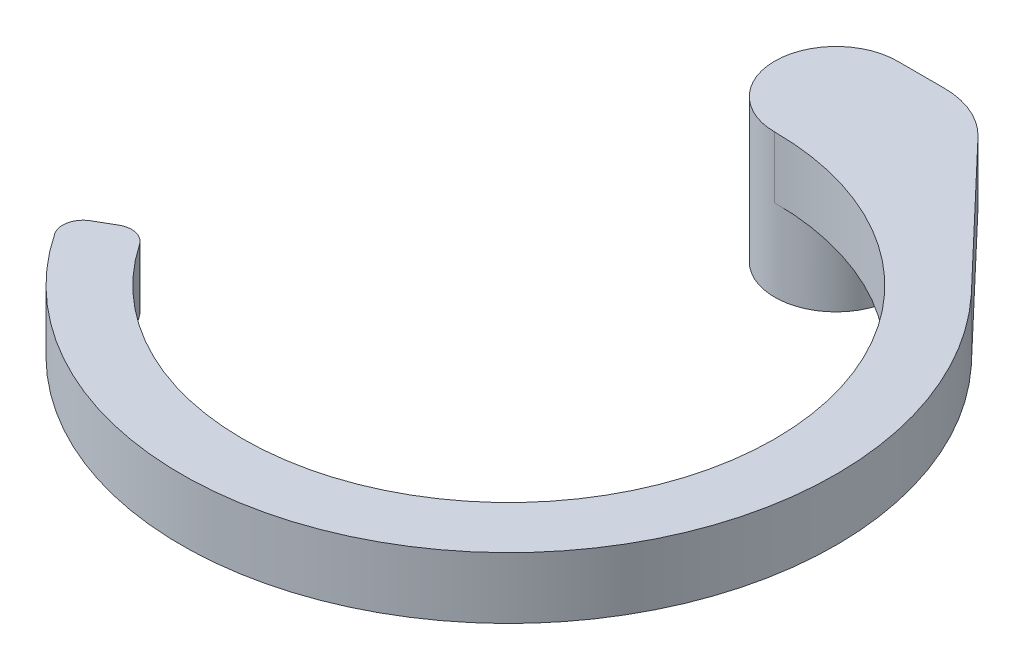
ISO-10303-21;
HEADER;
FILE_DESCRIPTION(('STEP AP214'),'2;1');
FILE_NAME('part.step','',(''),(''),'','','');
FILE_SCHEMA(('AUTOMOTIVE_DESIGN { 1 0 10303 214 1 1 1 1 }'));
ENDSEC;
DATA;
#1=APPLICATION_CONTEXT('core data for automotive mechanical design processes');
#2=APPLICATION_PROTOCOL_DEFINITION('international standard','automotive_design',2000,#1);
#3=PRODUCT_CONTEXT('',#1,'mechanical');
#4=PRODUCT('Part','Part','',(#3));
#5=PRODUCT_RELATED_PRODUCT_CATEGORY('part','',(#4));
#6=PRODUCT_DEFINITION_FORMATION('','',#4);
#7=PRODUCT_DEFINITION_CONTEXT('part definition',#1,'design');
#8=PRODUCT_DEFINITION('design','',#6,#7);
#9=PRODUCT_DEFINITION_SHAPE('','',#8);
#10=(LENGTH_UNIT() NAMED_UNIT(*) SI_UNIT(.MILLI.,.METRE.));
#11=(NAMED_UNIT(*) PLANE_ANGLE_UNIT() SI_UNIT($,.RADIAN.));
#12=(NAMED_UNIT(*) SI_UNIT($,.STERADIAN.) SOLID_ANGLE_UNIT());
#13=UNCERTAINTY_MEASURE_WITH_UNIT(LENGTH_MEASURE(1.E-05),#10,'distance_accuracy_value','');
#14=(GEOMETRIC_REPRESENTATION_CONTEXT(3) GLOBAL_UNCERTAINTY_ASSIGNED_CONTEXT((#13)) GLOBAL_UNIT_ASSIGNED_CONTEXT((#10,
#11,#12)) REPRESENTATION_CONTEXT('',''));
#15=CARTESIAN_POINT('',(0.,0.,0.));
#16=DIRECTION('',(0.,0.,1.));
#17=DIRECTION('',(1.,0.,0.));
#18=AXIS2_PLACEMENT_3D('',#15,#16,#17);
#19=CARTESIAN_POINT('',(0.,0.,0.));
#20=DIRECTION('',(0.,1.,0.));
#21=DIRECTION('',(0.,0.,1.));
#22=AXIS2_PLACEMENT_3D('',#19,#20,#21);
#23=PLANE('',#22);
#24=CARTESIAN_POINT('',(0.,0.,-80.));
#25=DIRECTION('',(0.,-1.,0.));
#26=DIRECTION('',(0.,0.,-1.));
#27=AXIS2_PLACEMENT_3D('',#24,#25,#26);
#28=CIRCLE('',#27,15.);
#29=CARTESIAN_POINT('',(0.,0.,-95.));
#30=VERTEX_POINT('',#29);
#31=CARTESIAN_POINT('',(0.,0.,-65.));
#32=VERTEX_POINT('',#31);
#33=EDGE_CURVE('E169',#30,#32,#28,.T.);
#34=ORIENTED_EDGE('',*,*,#33,.F.);
#35=DIRECTION('',(1.,0.,0.));
#36=VECTOR('',#35,1.);
#37=CARTESIAN_POINT('',(-1.15370923512719E-13,0.,-95.));
#38=LINE('',#37,#36);
#39=CARTESIAN_POINT('',(11.4274013035618,0.,-95.));
#40=VERTEX_POINT('',#39);
#41=EDGE_CURVE('E152',#30,#40,#38,.T.);
#42=ORIENTED_EDGE('',*,*,#41,.T.);
#43=CARTESIAN_POINT('',(11.4274013035615,0.,-75.));
#44=DIRECTION('',(0.,1.,0.));
#45=DIRECTION('',(0.,0.,1.));
#46=AXIS2_PLACEMENT_3D('',#43,#44,#45);
#47=CIRCLE('',#46,20.0000000000001);
#48=CARTESIAN_POINT('',(25.911523347206,0.,-88.7916717124799));
#49=VERTEX_POINT('',#48);
#50=EDGE_CURVE('E149',#40,#49,#47,.F.);
#51=ORIENTED_EDGE('',*,*,#50,.T.);
#52=DIRECTION('',(0.689583585623996,0.,0.724206102182212));
#53=VECTOR('',#52,1.);
#54=CARTESIAN_POINT('',(57.9325504327501,0.,-55.1629373618664));
#55=LINE('',#54,#53);
#56=CARTESIAN_POINT('',(58.5757297296054,0.,-54.4874654085159));
#57=VERTEX_POINT('',#56);
#58=EDGE_CURVE('E146',#49,#57,#55,.T.);
#59=ORIENTED_EDGE('',*,*,#58,.T.);
#60=CARTESIAN_POINT('',(0.,0.,0.));
#61=DIRECTION('',(0.,1.,0.));
#62=DIRECTION('',(0.,0.,1.));
#63=AXIS2_PLACEMENT_3D('',#60,#61,#62);
#64=CIRCLE('',#63,80.);
#65=CARTESIAN_POINT('',(-66.4612341163506,0.,44.5298142791056));
#66=VERTEX_POINT('',#65);
#67=EDGE_CURVE('E142',#66,#57,#64,.T.);
#68=ORIENTED_EDGE('',*,*,#67,.F.);
#69=CARTESIAN_POINT('',(-62.3074069840787,0.,41.7467008866615));
#70=DIRECTION('',(0.,1.,0.));
#71=DIRECTION('',(0.,0.,1.));
#72=AXIS2_PLACEMENT_3D('',#69,#70,#71);
#73=CIRCLE('',#72,5.00000000000001);
#74=CARTESIAN_POINT('',(-64.8074069840787,0.,37.4165738677393));
#75=VERTEX_POINT('',#74);
#76=EDGE_CURVE('E139',#66,#75,#73,.F.);
#77=ORIENTED_EDGE('',*,*,#76,.T.);
#78=DIRECTION('',(-0.86602540378444,0.,0.499999999999997));
#79=VECTOR('',#78,1.);
#80=CARTESIAN_POINT('',(0.,0.,0.));
#81=LINE('',#80,#79);
#82=CARTESIAN_POINT('',(-60.4669331122392,0.,34.9106001094222));
#83=VERTEX_POINT('',#82);
#84=EDGE_CURVE('E154',#83,#75,#81,.T.);
#85=ORIENTED_EDGE('',*,*,#84,.F.);
#86=CARTESIAN_POINT('',(-57.9669331122392,0.,39.2407271283444));
#87=DIRECTION('',(0.,1.,0.));
#88=DIRECTION('',(0.,0.,1.));
#89=AXIS2_PLACEMENT_3D('',#86,#87,#88);
#90=CIRCLE('',#89,5.);
#91=CARTESIAN_POINT('',(-53.8264378899364,0.,36.4378180477484));
#92=VERTEX_POINT('',#91);
#93=EDGE_CURVE('E82',#92,#83,#90,.T.);
#94=ORIENTED_EDGE('',*,*,#93,.F.);
#95=CARTESIAN_POINT('',(0.,0.,0.));
#96=DIRECTION('',(0.,1.,0.));
#97=DIRECTION('',(0.,0.,1.));
#98=AXIS2_PLACEMENT_3D('',#95,#96,#97);
#99=CIRCLE('',#98,65.);
#100=EDGE_CURVE('E121',#92,#32,#99,.T.);
#101=ORIENTED_EDGE('',*,*,#100,.T.);
#102=EDGE_LOOP('',(#34,#42,#51,#59,#68,#77,#85,#94,#101));
#103=FACE_BOUND('',#102,.T.);
#104=ADVANCED_FACE('F35',(#103),#23,.F.);
#105=CARTESIAN_POINT('',(-62.3074069840787,15.,41.7467008866615));
#106=DIRECTION('',(0.,-1.,0.));
#107=DIRECTION('',(0.,0.,-1.));
#108=AXIS2_PLACEMENT_3D('',#105,#106,#107);
#109=CYLINDRICAL_SURFACE('',#108,5.00000000000001);
#110=ORIENTED_EDGE('',*,*,#76,.F.);
#111=DIRECTION('',(0.,-1.,0.));
#112=VECTOR('',#111,1.);
#113=CARTESIAN_POINT('',(-66.4612341163506,15.,44.5298142791056));
#114=LINE('',#113,#112);
#115=CARTESIAN_POINT('',(-66.4612341163506,15.,44.5298142791056));
#116=VERTEX_POINT('',#115);
#117=EDGE_CURVE('E11',#116,#66,#114,.T.);
#118=ORIENTED_EDGE('',*,*,#117,.F.);
#119=CARTESIAN_POINT('',(-62.3074069840787,15.,41.7467008866615));
#120=DIRECTION('',(0.,1.,0.));
#121=DIRECTION('',(0.,0.,1.));
#122=AXIS2_PLACEMENT_3D('',#119,#120,#121);
#123=CIRCLE('',#122,5.00000000000001);
#124=CARTESIAN_POINT('',(-64.8074069840787,15.,37.4165738677393));
#125=VERTEX_POINT('',#124);
#126=EDGE_CURVE('E156',#116,#125,#123,.F.);
#127=ORIENTED_EDGE('',*,*,#126,.T.);
#128=DIRECTION('',(0.,-1.,0.));
#129=VECTOR('',#128,1.);
#130=CARTESIAN_POINT('',(-64.8074069840787,15.,37.4165738677393));
#131=LINE('',#130,#129);
#132=EDGE_CURVE('E89',#125,#75,#131,.T.);
#133=ORIENTED_EDGE('',*,*,#132,.T.);
#134=EDGE_LOOP('',(#110,#118,#127,#133));
#135=FACE_BOUND('',#134,.T.);
#136=ADVANCED_FACE('F37',(#135),#109,.T.);
#137=CARTESIAN_POINT('',(0.,15.,0.));
#138=DIRECTION('',(0.,-1.,0.));
#139=DIRECTION('',(0.,0.,-1.));
#140=AXIS2_PLACEMENT_3D('',#137,#138,#139);
#141=CYLINDRICAL_SURFACE('',#140,80.);
#142=ORIENTED_EDGE('',*,*,#67,.T.);
#143=DIRECTION('',(0.,-1.,0.));
#144=VECTOR('',#143,1.);
#145=CARTESIAN_POINT('',(58.5757297296054,15.,-54.4874654085159));
#146=LINE('',#145,#144);
#147=CARTESIAN_POINT('',(58.5757297296054,15.,-54.4874654085159));
#148=VERTEX_POINT('',#147);
#149=EDGE_CURVE('E45',#148,#57,#146,.T.);
#150=ORIENTED_EDGE('',*,*,#149,.F.);
#151=CARTESIAN_POINT('',(0.,15.,0.));
#152=DIRECTION('',(0.,1.,0.));
#153=DIRECTION('',(0.,0.,1.));
#154=AXIS2_PLACEMENT_3D('',#151,#152,#153);
#155=CIRCLE('',#154,80.);
#156=EDGE_CURVE('E175',#116,#148,#155,.T.);
#157=ORIENTED_EDGE('',*,*,#156,.F.);
#158=ORIENTED_EDGE('',*,*,#117,.T.);
#159=EDGE_LOOP('',(#142,#150,#157,#158));
#160=FACE_BOUND('',#159,.T.);
#161=ADVANCED_FACE('F210',(#160),#141,.T.);
#162=CARTESIAN_POINT('',(57.9325504327501,15.,-55.1629373618664));
#163=DIRECTION('',(0.724206102182212,0.,-0.689583585623996));
#164=DIRECTION('',(-0.689583585623996,0.,-0.724206102182212));
#165=AXIS2_PLACEMENT_3D('',#162,#163,#164);
#166=PLANE('',#165);
#167=ORIENTED_EDGE('',*,*,#58,.F.);
#168=DIRECTION('',(0.,-1.,0.));
#169=VECTOR('',#168,1.);
#170=CARTESIAN_POINT('',(25.911523347206,15.,-88.7916717124799));
#171=LINE('',#170,#169);
#172=CARTESIAN_POINT('',(25.911523347206,15.,-88.7916717124799));
#173=VERTEX_POINT('',#172);
#174=EDGE_CURVE('E161',#173,#49,#171,.T.);
#175=ORIENTED_EDGE('',*,*,#174,.F.);
#176=DIRECTION('',(0.689583585623996,0.,0.724206102182212));
#177=VECTOR('',#176,1.);
#178=CARTESIAN_POINT('',(57.9325504327501,15.,-55.1629373618664));
#179=LINE('',#178,#177);
#180=EDGE_CURVE('E177',#173,#148,#179,.T.);
#181=ORIENTED_EDGE('',*,*,#180,.T.);
#182=ORIENTED_EDGE('',*,*,#149,.T.);
#183=EDGE_LOOP('',(#167,#175,#181,#182));
#184=FACE_BOUND('',#183,.T.);
#185=ADVANCED_FACE('F212',(#184),#166,.T.);
#186=CARTESIAN_POINT('',(11.4274013035615,15.,-75.));
#187=DIRECTION('',(0.,-1.,0.));
#188=DIRECTION('',(0.,0.,-1.));
#189=AXIS2_PLACEMENT_3D('',#186,#187,#188);
#190=CYLINDRICAL_SURFACE('',#189,20.0000000000001);
#191=ORIENTED_EDGE('',*,*,#50,.F.);
#192=DIRECTION('',(0.,-1.,0.));
#193=VECTOR('',#192,1.);
#194=CARTESIAN_POINT('',(11.4274013035618,15.,-95.));
#195=LINE('',#194,#193);
#196=CARTESIAN_POINT('',(11.4274013035618,15.,-95.));
#197=VERTEX_POINT('',#196);
#198=EDGE_CURVE('E159',#197,#40,#195,.T.);
#199=ORIENTED_EDGE('',*,*,#198,.F.);
#200=CARTESIAN_POINT('',(11.4274013035615,15.,-75.));
#201=DIRECTION('',(0.,1.,0.));
#202=DIRECTION('',(0.,0.,1.));
#203=AXIS2_PLACEMENT_3D('',#200,#201,#202);
#204=CIRCLE('',#203,20.0000000000001);
#205=EDGE_CURVE('E180',#197,#173,#204,.F.);
#206=ORIENTED_EDGE('',*,*,#205,.T.);
#207=ORIENTED_EDGE('',*,*,#174,.T.);
#208=EDGE_LOOP('',(#191,#199,#206,#207));
#209=FACE_BOUND('',#208,.T.);
#210=ADVANCED_FACE('F191',(#209),#190,.T.);
#211=CARTESIAN_POINT('',(-1.15370923512719E-13,15.,-95.));
#212=DIRECTION('',(0.,0.,-1.));
#213=DIRECTION('',(-1.,0.,0.));
#214=AXIS2_PLACEMENT_3D('',#211,#212,#213);
#215=PLANE('',#214);
#216=ORIENTED_EDGE('',*,*,#41,.F.);
#217=DIRECTION('',(0.,-1.,0.));
#218=VECTOR('',#217,1.);
#219=CARTESIAN_POINT('',(0.,15.,-95.));
#220=LINE('',#219,#218);
#221=CARTESIAN_POINT('',(0.,15.,-95.));
#222=VERTEX_POINT('',#221);
#223=EDGE_CURVE('E162',#222,#30,#220,.T.);
#224=ORIENTED_EDGE('',*,*,#223,.F.);
#225=DIRECTION('',(1.,0.,0.));
#226=VECTOR('',#225,1.);
#227=CARTESIAN_POINT('',(-1.15370923512719E-13,15.,-95.));
#228=LINE('',#227,#226);
#229=EDGE_CURVE('E134',#222,#197,#228,.T.);
#230=ORIENTED_EDGE('',*,*,#229,.T.);
#231=ORIENTED_EDGE('',*,*,#198,.T.);
#232=EDGE_LOOP('',(#216,#224,#230,#231));
#233=FACE_BOUND('',#232,.T.);
#234=ADVANCED_FACE('F185',(#233),#215,.T.);
#235=CARTESIAN_POINT('',(0.,15.,-80.));
#236=DIRECTION('',(0.,-1.,0.));
#237=DIRECTION('',(0.,0.,-1.));
#238=AXIS2_PLACEMENT_3D('',#235,#236,#237);
#239=CYLINDRICAL_SURFACE('',#238,15.);
#240=ORIENTED_EDGE('',*,*,#223,.T.);
#241=ORIENTED_EDGE('',*,*,#33,.T.);
#242=DIRECTION('',(0.,-1.,0.));
#243=VECTOR('',#242,1.);
#244=CARTESIAN_POINT('',(0.,15.,-65.));
#245=LINE('',#244,#243);
#246=CARTESIAN_POINT('',(0.,15.,-65.));
#247=VERTEX_POINT('',#246);
#248=EDGE_CURVE('E122',#247,#32,#245,.T.);
#249=ORIENTED_EDGE('',*,*,#248,.F.);
#250=CARTESIAN_POINT('',(0.,15.,-80.));
#251=DIRECTION('',(0.,1.,0.));
#252=DIRECTION('',(0.,0.,1.));
#253=AXIS2_PLACEMENT_3D('',#250,#251,#252);
#254=CIRCLE('',#253,15.);
#255=EDGE_CURVE('E131',#222,#247,#254,.T.);
#256=ORIENTED_EDGE('',*,*,#255,.F.);
#257=EDGE_LOOP('',(#240,#241,#249,#256));
#258=FACE_BOUND('',#257,.T.);
#259=CARTESIAN_POINT('',(0.,-20.,-80.));
#260=DIRECTION('',(0.,-1.,0.));
#261=DIRECTION('',(0.,0.,-1.));
#262=AXIS2_PLACEMENT_3D('',#259,#260,#261);
#263=CIRCLE('',#262,15.);
#264=CARTESIAN_POINT('',(0.,-20.,-95.));
#265=VERTEX_POINT('',#264);
#266=EDGE_CURVE('E143',#265,#265,#263,.T.);
#267=ORIENTED_EDGE('',*,*,#266,.F.);
#268=EDGE_LOOP('',(#267));
#269=FACE_BOUND('',#268,.T.);
#270=ADVANCED_FACE('F234',(#258,#269),#239,.T.);
#271=CARTESIAN_POINT('',(0.,15.,0.));
#272=DIRECTION('',(0.,-1.,0.));
#273=DIRECTION('',(0.,0.,-1.));
#274=AXIS2_PLACEMENT_3D('',#271,#272,#273);
#275=CYLINDRICAL_SURFACE('',#274,65.);
#276=ORIENTED_EDGE('',*,*,#100,.F.);
#277=DIRECTION('',(0.,-1.,0.));
#278=VECTOR('',#277,1.);
#279=CARTESIAN_POINT('',(-53.8264378899364,15.,36.4378180477484));
#280=LINE('',#279,#278);
#281=CARTESIAN_POINT('',(-53.8264378899364,15.,36.4378180477484));
#282=VERTEX_POINT('',#281);
#283=EDGE_CURVE('E114',#282,#92,#280,.T.);
#284=ORIENTED_EDGE('',*,*,#283,.F.);
#285=CARTESIAN_POINT('',(0.,15.,0.));
#286=DIRECTION('',(0.,1.,0.));
#287=DIRECTION('',(0.,0.,1.));
#288=AXIS2_PLACEMENT_3D('',#285,#286,#287);
#289=CIRCLE('',#288,65.);
#290=EDGE_CURVE('E119',#282,#247,#289,.T.);
#291=ORIENTED_EDGE('',*,*,#290,.T.);
#292=ORIENTED_EDGE('',*,*,#248,.T.);
#293=EDGE_LOOP('',(#276,#284,#291,#292));
#294=FACE_BOUND('',#293,.T.);
#295=ADVANCED_FACE('F116',(#294),#275,.F.);
#296=CARTESIAN_POINT('',(-57.9669331122392,15.,39.2407271283444));
#297=DIRECTION('',(0.,-1.,0.));
#298=DIRECTION('',(0.,0.,-1.));
#299=AXIS2_PLACEMENT_3D('',#296,#297,#298);
#300=CYLINDRICAL_SURFACE('',#299,5.);
#301=ORIENTED_EDGE('',*,*,#93,.T.);
#302=DIRECTION('',(0.,-1.,0.));
#303=VECTOR('',#302,1.);
#304=CARTESIAN_POINT('',(-60.4669331122392,15.,34.9106001094222));
#305=LINE('',#304,#303);
#306=CARTESIAN_POINT('',(-60.4669331122392,15.,34.9106001094222));
#307=VERTEX_POINT('',#306);
#308=EDGE_CURVE('E123',#307,#83,#305,.T.);
#309=ORIENTED_EDGE('',*,*,#308,.F.);
#310=CARTESIAN_POINT('',(-57.9669331122392,15.,39.2407271283444));
#311=DIRECTION('',(0.,1.,0.));
#312=DIRECTION('',(0.,0.,1.));
#313=AXIS2_PLACEMENT_3D('',#310,#311,#312);
#314=CIRCLE('',#313,5.);
#315=EDGE_CURVE('E125',#282,#307,#314,.T.);
#316=ORIENTED_EDGE('',*,*,#315,.F.);
#317=ORIENTED_EDGE('',*,*,#283,.T.);
#318=EDGE_LOOP('',(#301,#309,#316,#317));
#319=FACE_BOUND('',#318,.T.);
#320=ADVANCED_FACE('F126',(#319),#300,.T.);
#321=CARTESIAN_POINT('',(0.,15.,0.));
#322=DIRECTION('',(0.499999999999997,0.,0.86602540378444));
#323=DIRECTION('',(0.86602540378444,0.,-0.499999999999997));
#324=AXIS2_PLACEMENT_3D('',#321,#322,#323);
#325=PLANE('',#324);
#326=ORIENTED_EDGE('',*,*,#84,.T.);
#327=ORIENTED_EDGE('',*,*,#132,.F.);
#328=DIRECTION('',(-0.86602540378444,0.,0.499999999999997));
#329=VECTOR('',#328,1.);
#330=CARTESIAN_POINT('',(0.,15.,0.));
#331=LINE('',#330,#329);
#332=EDGE_CURVE('E54',#307,#125,#331,.T.);
#333=ORIENTED_EDGE('',*,*,#332,.F.);
#334=ORIENTED_EDGE('',*,*,#308,.T.);
#335=EDGE_LOOP('',(#326,#327,#333,#334));
#336=FACE_BOUND('',#335,.T.);
#337=ADVANCED_FACE('F207',(#336),#325,.F.);
#338=CARTESIAN_POINT('',(0.,15.,0.));
#339=DIRECTION('',(0.,1.,0.));
#340=DIRECTION('',(0.,0.,1.));
#341=AXIS2_PLACEMENT_3D('',#338,#339,#340);
#342=PLANE('',#341);
#343=ORIENTED_EDGE('',*,*,#126,.F.);
#344=ORIENTED_EDGE('',*,*,#156,.T.);
#345=ORIENTED_EDGE('',*,*,#180,.F.);
#346=ORIENTED_EDGE('',*,*,#205,.F.);
#347=ORIENTED_EDGE('',*,*,#229,.F.);
#348=ORIENTED_EDGE('',*,*,#255,.T.);
#349=ORIENTED_EDGE('',*,*,#290,.F.);
#350=ORIENTED_EDGE('',*,*,#315,.T.);
#351=ORIENTED_EDGE('',*,*,#332,.T.);
#352=EDGE_LOOP('',(#343,#344,#345,#346,#347,#348,#349,#350,#351));
#353=FACE_BOUND('',#352,.T.);
#354=ADVANCED_FACE('F128',(#353),#342,.T.);
#355=CARTESIAN_POINT('',(0.,-20.,-80.));
#356=DIRECTION('',(0.,-1.,0.));
#357=DIRECTION('',(0.,0.,-1.));
#358=AXIS2_PLACEMENT_3D('',#355,#356,#357);
#359=PLANE('',#358);
#360=CARTESIAN_POINT('',(0.,-20.,-80.));
#361=DIRECTION('',(0.,-1.,0.));
#362=DIRECTION('',(0.,0.,-1.));
#363=AXIS2_PLACEMENT_3D('',#360,#361,#362);
#364=CIRCLE('',#363,10.);
#365=CARTESIAN_POINT('',(0.,-20.,-90.));
#366=VERTEX_POINT('',#365);
#367=EDGE_CURVE('E335',#366,#366,#364,.T.);
#368=ORIENTED_EDGE('',*,*,#367,.F.);
#369=EDGE_LOOP('',(#368));
#370=FACE_BOUND('',#369,.T.);
#371=ORIENTED_EDGE('',*,*,#266,.T.);
#372=EDGE_LOOP('',(#371));
#373=FACE_BOUND('',#372,.T.);
#374=ADVANCED_FACE('F265',(#370,#373),#359,.T.);
#375=CARTESIAN_POINT('',(0.,-18.,-80.));
#376=DIRECTION('',(0.,-1.,0.));
#377=DIRECTION('',(0.,0.,-1.));
#378=AXIS2_PLACEMENT_3D('',#375,#376,#377);
#379=CYLINDRICAL_SURFACE('',#378,10.);
#380=CARTESIAN_POINT('',(0.,-18.,-80.));
#381=DIRECTION('',(0.,-1.,0.));
#382=DIRECTION('',(0.,0.,-1.));
#383=AXIS2_PLACEMENT_3D('',#380,#381,#382);
#384=CIRCLE('',#383,10.);
#385=CARTESIAN_POINT('',(0.,-18.,-90.));
#386=VERTEX_POINT('',#385);
#387=EDGE_CURVE('E172',#386,#386,#384,.T.);
#388=ORIENTED_EDGE('',*,*,#387,.F.);
#389=EDGE_LOOP('',(#388));
#390=FACE_BOUND('',#389,.T.);
#391=ORIENTED_EDGE('',*,*,#367,.T.);
#392=EDGE_LOOP('',(#391));
#393=FACE_BOUND('',#392,.T.);
#394=ADVANCED_FACE('F270',(#390,#393),#379,.F.);
#395=CARTESIAN_POINT('',(0.,-18.,-80.));
#396=DIRECTION('',(0.,-1.,0.));
#397=DIRECTION('',(0.,0.,-1.));
#398=AXIS2_PLACEMENT_3D('',#395,#396,#397);
#399=PLANE('',#398);
#400=ORIENTED_EDGE('',*,*,#387,.T.);
#401=EDGE_LOOP('',(#400));
#402=FACE_BOUND('',#401,.T.);
#403=ADVANCED_FACE('F277',(#402),#399,.T.);
#404=CLOSED_SHELL('',(#104,#136,#161,#185,#210,#234,#270,#295,#320,#337,#354,#374,#394,#403));
#405=MANIFOLD_SOLID_BREP('B2',#404);
#406=ADVANCED_BREP_SHAPE_REPRESENTATION('',(#18,#405),#14);
#407=SHAPE_DEFINITION_REPRESENTATION(#9,#406);
ENDSEC;
END-ISO-10303-21;
